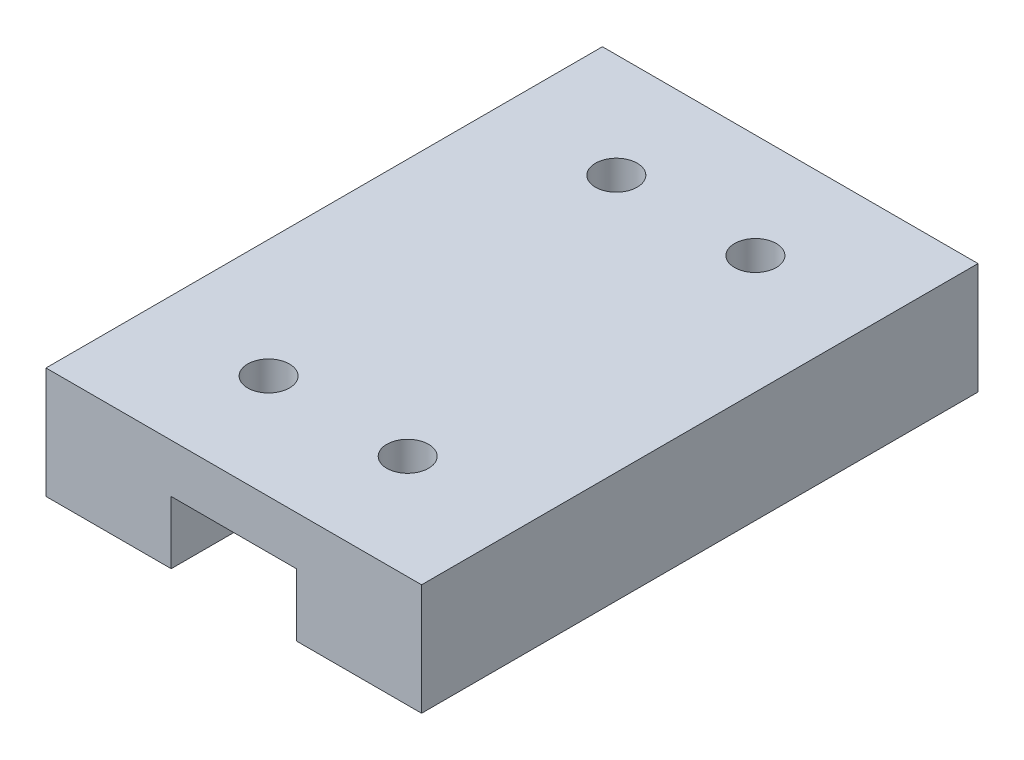
ISO-10303-21;
HEADER;
FILE_DESCRIPTION(('STEP AP214'),'2;1');
FILE_NAME('part.step','',(''),(''),'','','');
FILE_SCHEMA(('AUTOMOTIVE_DESIGN { 1 0 10303 214 1 1 1 1 }'));
ENDSEC;
DATA;
#1=APPLICATION_CONTEXT('core data for automotive mechanical design processes');
#2=APPLICATION_PROTOCOL_DEFINITION('international standard','automotive_design',2000,#1);
#3=PRODUCT_CONTEXT('',#1,'mechanical');
#4=PRODUCT('Part','Part','',(#3));
#5=PRODUCT_RELATED_PRODUCT_CATEGORY('part','',(#4));
#6=PRODUCT_DEFINITION_FORMATION('','',#4);
#7=PRODUCT_DEFINITION_CONTEXT('part definition',#1,'design');
#8=PRODUCT_DEFINITION('design','',#6,#7);
#9=PRODUCT_DEFINITION_SHAPE('','',#8);
#10=(LENGTH_UNIT() NAMED_UNIT(*) SI_UNIT(.MILLI.,.METRE.));
#11=(NAMED_UNIT(*) PLANE_ANGLE_UNIT() SI_UNIT($,.RADIAN.));
#12=(NAMED_UNIT(*) SI_UNIT($,.STERADIAN.) SOLID_ANGLE_UNIT());
#13=UNCERTAINTY_MEASURE_WITH_UNIT(LENGTH_MEASURE(1.E-05),#10,'distance_accuracy_value','');
#14=(GEOMETRIC_REPRESENTATION_CONTEXT(3) GLOBAL_UNCERTAINTY_ASSIGNED_CONTEXT((#13)) GLOBAL_UNIT_ASSIGNED_CONTEXT((#10,
#11,#12)) REPRESENTATION_CONTEXT('',''));
#15=CARTESIAN_POINT('',(0.,0.,0.));
#16=DIRECTION('',(0.,0.,1.));
#17=DIRECTION('',(1.,0.,0.));
#18=AXIS2_PLACEMENT_3D('',#15,#16,#17);
#19=CARTESIAN_POINT('',(4.5,4.5,20.));
#20=DIRECTION('',(1.,0.,0.));
#21=DIRECTION('',(0.,0.,-1.));
#22=AXIS2_PLACEMENT_3D('',#19,#20,#21);
#23=PLANE('',#22);
#24=DIRECTION('',(0.,-1.,0.));
#25=VECTOR('',#24,1.);
#26=CARTESIAN_POINT('',(4.5,4.5,-20.));
#27=LINE('',#26,#25);
#28=CARTESIAN_POINT('',(4.5,4.5,-20.));
#29=VERTEX_POINT('',#28);
#30=CARTESIAN_POINT('',(4.5,0.,-20.));
#31=VERTEX_POINT('',#30);
#32=EDGE_CURVE('E137',#29,#31,#27,.T.);
#33=ORIENTED_EDGE('',*,*,#32,.T.);
#34=DIRECTION('',(0.,0.,-1.));
#35=VECTOR('',#34,1.);
#36=CARTESIAN_POINT('',(4.5,0.,20.));
#37=LINE('',#36,#35);
#38=CARTESIAN_POINT('',(4.5,0.,20.));
#39=VERTEX_POINT('',#38);
#40=EDGE_CURVE('E11',#39,#31,#37,.T.);
#41=ORIENTED_EDGE('',*,*,#40,.F.);
#42=DIRECTION('',(0.,-1.,0.));
#43=VECTOR('',#42,1.);
#44=CARTESIAN_POINT('',(4.5,4.5,20.));
#45=LINE('',#44,#43);
#46=CARTESIAN_POINT('',(4.5,4.5,20.));
#47=VERTEX_POINT('',#46);
#48=EDGE_CURVE('E152',#47,#39,#45,.T.);
#49=ORIENTED_EDGE('',*,*,#48,.F.);
#50=DIRECTION('',(0.,0.,-1.));
#51=VECTOR('',#50,1.);
#52=CARTESIAN_POINT('',(4.5,4.5,20.));
#53=LINE('',#52,#51);
#54=EDGE_CURVE('E133',#47,#29,#53,.T.);
#55=ORIENTED_EDGE('',*,*,#54,.T.);
#56=EDGE_LOOP('',(#33,#41,#49,#55));
#57=FACE_BOUND('',#56,.T.);
#58=ADVANCED_FACE('F41',(#57),#23,.F.);
#59=CARTESIAN_POINT('',(4.5,0.,20.));
#60=DIRECTION('',(0.,1.,0.));
#61=DIRECTION('',(-1.,0.,0.));
#62=AXIS2_PLACEMENT_3D('',#59,#60,#61);
#63=PLANE('',#62);
#64=DIRECTION('',(1.,0.,0.));
#65=VECTOR('',#64,1.);
#66=CARTESIAN_POINT('',(4.5,0.,-20.));
#67=LINE('',#66,#65);
#68=CARTESIAN_POINT('',(13.5,0.,-20.));
#69=VERTEX_POINT('',#68);
#70=EDGE_CURVE('E140',#31,#69,#67,.T.);
#71=ORIENTED_EDGE('',*,*,#70,.T.);
#72=DIRECTION('',(0.,0.,-1.));
#73=VECTOR('',#72,1.);
#74=CARTESIAN_POINT('',(13.5,0.,20.));
#75=LINE('',#74,#73);
#76=CARTESIAN_POINT('',(13.5,0.,20.));
#77=VERTEX_POINT('',#76);
#78=EDGE_CURVE('E49',#77,#69,#75,.T.);
#79=ORIENTED_EDGE('',*,*,#78,.F.);
#80=DIRECTION('',(1.,0.,0.));
#81=VECTOR('',#80,1.);
#82=CARTESIAN_POINT('',(4.5,0.,20.));
#83=LINE('',#82,#81);
#84=EDGE_CURVE('E100',#39,#77,#83,.T.);
#85=ORIENTED_EDGE('',*,*,#84,.F.);
#86=ORIENTED_EDGE('',*,*,#40,.T.);
#87=EDGE_LOOP('',(#71,#79,#85,#86));
#88=FACE_BOUND('',#87,.T.);
#89=ADVANCED_FACE('F238',(#88),#63,.F.);
#90=CARTESIAN_POINT('',(13.5,0.,20.));
#91=DIRECTION('',(-1.,0.,0.));
#92=DIRECTION('',(0.,0.,1.));
#93=AXIS2_PLACEMENT_3D('',#90,#91,#92);
#94=PLANE('',#93);
#95=DIRECTION('',(0.,1.,0.));
#96=VECTOR('',#95,1.);
#97=CARTESIAN_POINT('',(13.5,0.,-20.));
#98=LINE('',#97,#96);
#99=CARTESIAN_POINT('',(13.5,8.,-20.));
#100=VERTEX_POINT('',#99);
#101=EDGE_CURVE('E143',#69,#100,#98,.T.);
#102=ORIENTED_EDGE('',*,*,#101,.T.);
#103=DIRECTION('',(0.,0.,-1.));
#104=VECTOR('',#103,1.);
#105=CARTESIAN_POINT('',(13.5,8.,20.));
#106=LINE('',#105,#104);
#107=CARTESIAN_POINT('',(13.5,8.,20.));
#108=VERTEX_POINT('',#107);
#109=EDGE_CURVE('E159',#108,#100,#106,.T.);
#110=ORIENTED_EDGE('',*,*,#109,.F.);
#111=DIRECTION('',(0.,1.,0.));
#112=VECTOR('',#111,1.);
#113=CARTESIAN_POINT('',(13.5,0.,20.));
#114=LINE('',#113,#112);
#115=EDGE_CURVE('E167',#77,#108,#114,.T.);
#116=ORIENTED_EDGE('',*,*,#115,.F.);
#117=ORIENTED_EDGE('',*,*,#78,.T.);
#118=EDGE_LOOP('',(#102,#110,#116,#117));
#119=FACE_BOUND('',#118,.T.);
#120=ADVANCED_FACE('F165',(#119),#94,.F.);
#121=CARTESIAN_POINT('',(13.5,8.,20.));
#122=DIRECTION('',(0.,-1.,0.));
#123=DIRECTION('',(1.,0.,0.));
#124=AXIS2_PLACEMENT_3D('',#121,#122,#123);
#125=PLANE('',#124);
#126=CARTESIAN_POINT('',(5.,8.,12.5));
#127=DIRECTION('',(0.,1.,0.));
#128=DIRECTION('',(1.,0.,0.));
#129=AXIS2_PLACEMENT_3D('',#126,#127,#128);
#130=CIRCLE('',#129,1.5);
#131=CARTESIAN_POINT('',(6.5,8.,12.5));
#132=VERTEX_POINT('',#131);
#133=EDGE_CURVE('E191',#132,#132,#130,.T.);
#134=ORIENTED_EDGE('',*,*,#133,.F.);
#135=EDGE_LOOP('',(#134));
#136=FACE_BOUND('',#135,.T.);
#137=CARTESIAN_POINT('',(-5.,8.,12.5));
#138=DIRECTION('',(0.,1.,0.));
#139=DIRECTION('',(-1.,0.,0.));
#140=AXIS2_PLACEMENT_3D('',#137,#138,#139);
#141=CIRCLE('',#140,1.5);
#142=CARTESIAN_POINT('',(-6.5,8.,12.5));
#143=VERTEX_POINT('',#142);
#144=EDGE_CURVE('E197',#143,#143,#141,.T.);
#145=ORIENTED_EDGE('',*,*,#144,.F.);
#146=EDGE_LOOP('',(#145));
#147=FACE_BOUND('',#146,.T.);
#148=CARTESIAN_POINT('',(-5.,8.,-12.5));
#149=DIRECTION('',(0.,1.,0.));
#150=DIRECTION('',(1.,0.,0.));
#151=AXIS2_PLACEMENT_3D('',#148,#149,#150);
#152=CIRCLE('',#151,1.5);
#153=CARTESIAN_POINT('',(-3.5,8.,-12.5));
#154=VERTEX_POINT('',#153);
#155=EDGE_CURVE('E203',#154,#154,#152,.T.);
#156=ORIENTED_EDGE('',*,*,#155,.F.);
#157=EDGE_LOOP('',(#156));
#158=FACE_BOUND('',#157,.T.);
#159=CARTESIAN_POINT('',(5.,8.,-12.5));
#160=DIRECTION('',(0.,1.,0.));
#161=DIRECTION('',(-1.,0.,0.));
#162=AXIS2_PLACEMENT_3D('',#159,#160,#161);
#163=CIRCLE('',#162,1.5);
#164=CARTESIAN_POINT('',(3.5,8.,-12.5));
#165=VERTEX_POINT('',#164);
#166=EDGE_CURVE('E185',#165,#165,#163,.T.);
#167=ORIENTED_EDGE('',*,*,#166,.F.);
#168=EDGE_LOOP('',(#167));
#169=FACE_BOUND('',#168,.T.);
#170=DIRECTION('',(-1.,0.,0.));
#171=VECTOR('',#170,1.);
#172=CARTESIAN_POINT('',(13.5,8.,-20.));
#173=LINE('',#172,#171);
#174=CARTESIAN_POINT('',(-13.5,8.,-20.));
#175=VERTEX_POINT('',#174);
#176=EDGE_CURVE('E145',#100,#175,#173,.T.);
#177=ORIENTED_EDGE('',*,*,#176,.T.);
#178=DIRECTION('',(0.,0.,-1.));
#179=VECTOR('',#178,1.);
#180=CARTESIAN_POINT('',(-13.5,8.,20.));
#181=LINE('',#180,#179);
#182=CARTESIAN_POINT('',(-13.5,8.,20.));
#183=VERTEX_POINT('',#182);
#184=EDGE_CURVE('E156',#183,#175,#181,.T.);
#185=ORIENTED_EDGE('',*,*,#184,.F.);
#186=DIRECTION('',(-1.,0.,0.));
#187=VECTOR('',#186,1.);
#188=CARTESIAN_POINT('',(13.5,8.,20.));
#189=LINE('',#188,#187);
#190=EDGE_CURVE('E179',#108,#183,#189,.T.);
#191=ORIENTED_EDGE('',*,*,#190,.F.);
#192=ORIENTED_EDGE('',*,*,#109,.T.);
#193=EDGE_LOOP('',(#177,#185,#191,#192));
#194=FACE_BOUND('',#193,.T.);
#195=ADVANCED_FACE('F175',(#136,#147,#158,#169,#194),#125,.F.);
#196=CARTESIAN_POINT('',(-13.5,0.,20.));
#197=DIRECTION('',(1.,0.,0.));
#198=DIRECTION('',(0.,1.,0.));
#199=AXIS2_PLACEMENT_3D('',#196,#197,#198);
#200=PLANE('',#199);
#201=DIRECTION('',(0.,-1.,0.));
#202=VECTOR('',#201,1.);
#203=CARTESIAN_POINT('',(-13.5,0.,-20.));
#204=LINE('',#203,#202);
#205=CARTESIAN_POINT('',(-13.5,0.,-20.));
#206=VERTEX_POINT('',#205);
#207=EDGE_CURVE('E147',#175,#206,#204,.T.);
#208=ORIENTED_EDGE('',*,*,#207,.T.);
#209=DIRECTION('',(0.,0.,-1.));
#210=VECTOR('',#209,1.);
#211=CARTESIAN_POINT('',(-13.5,0.,20.));
#212=LINE('',#211,#210);
#213=CARTESIAN_POINT('',(-13.5,0.,20.));
#214=VERTEX_POINT('',#213);
#215=EDGE_CURVE('E128',#214,#206,#212,.T.);
#216=ORIENTED_EDGE('',*,*,#215,.F.);
#217=DIRECTION('',(0.,-1.,0.));
#218=VECTOR('',#217,1.);
#219=CARTESIAN_POINT('',(-13.5,0.,20.));
#220=LINE('',#219,#218);
#221=EDGE_CURVE('E119',#183,#214,#220,.T.);
#222=ORIENTED_EDGE('',*,*,#221,.F.);
#223=ORIENTED_EDGE('',*,*,#184,.T.);
#224=EDGE_LOOP('',(#208,#216,#222,#223));
#225=FACE_BOUND('',#224,.T.);
#226=ADVANCED_FACE('F178',(#225),#200,.F.);
#227=CARTESIAN_POINT('',(-4.5,0.,20.));
#228=DIRECTION('',(0.,1.,0.));
#229=DIRECTION('',(-1.,0.,0.));
#230=AXIS2_PLACEMENT_3D('',#227,#228,#229);
#231=PLANE('',#230);
#232=DIRECTION('',(1.,0.,0.));
#233=VECTOR('',#232,1.);
#234=CARTESIAN_POINT('',(-4.5,0.,-20.));
#235=LINE('',#234,#233);
#236=CARTESIAN_POINT('',(-4.5,0.,-20.));
#237=VERTEX_POINT('',#236);
#238=EDGE_CURVE('E127',#206,#237,#235,.T.);
#239=ORIENTED_EDGE('',*,*,#238,.T.);
#240=DIRECTION('',(0.,0.,-1.));
#241=VECTOR('',#240,1.);
#242=CARTESIAN_POINT('',(-4.5,0.,20.));
#243=LINE('',#242,#241);
#244=CARTESIAN_POINT('',(-4.5,0.,20.));
#245=VERTEX_POINT('',#244);
#246=EDGE_CURVE('E124',#245,#237,#243,.T.);
#247=ORIENTED_EDGE('',*,*,#246,.F.);
#248=DIRECTION('',(1.,0.,0.));
#249=VECTOR('',#248,1.);
#250=CARTESIAN_POINT('',(-4.5,0.,20.));
#251=LINE('',#250,#249);
#252=EDGE_CURVE('E113',#214,#245,#251,.T.);
#253=ORIENTED_EDGE('',*,*,#252,.F.);
#254=ORIENTED_EDGE('',*,*,#215,.T.);
#255=EDGE_LOOP('',(#239,#247,#253,#254));
#256=FACE_BOUND('',#255,.T.);
#257=ADVANCED_FACE('F125',(#256),#231,.F.);
#258=CARTESIAN_POINT('',(-4.5,4.5,20.));
#259=DIRECTION('',(-1.,0.,0.));
#260=DIRECTION('',(0.,-1.,0.));
#261=AXIS2_PLACEMENT_3D('',#258,#259,#260);
#262=PLANE('',#261);
#263=DIRECTION('',(0.,1.,0.));
#264=VECTOR('',#263,1.);
#265=CARTESIAN_POINT('',(-4.5,4.5,-20.));
#266=LINE('',#265,#264);
#267=CARTESIAN_POINT('',(-4.5,4.5,-20.));
#268=VERTEX_POINT('',#267);
#269=EDGE_CURVE('E86',#237,#268,#266,.T.);
#270=ORIENTED_EDGE('',*,*,#269,.T.);
#271=DIRECTION('',(0.,0.,-1.));
#272=VECTOR('',#271,1.);
#273=CARTESIAN_POINT('',(-4.5,4.5,20.));
#274=LINE('',#273,#272);
#275=CARTESIAN_POINT('',(-4.5,4.5,20.));
#276=VERTEX_POINT('',#275);
#277=EDGE_CURVE('E129',#276,#268,#274,.T.);
#278=ORIENTED_EDGE('',*,*,#277,.F.);
#279=DIRECTION('',(0.,1.,0.));
#280=VECTOR('',#279,1.);
#281=CARTESIAN_POINT('',(-4.5,4.5,20.));
#282=LINE('',#281,#280);
#283=EDGE_CURVE('E117',#245,#276,#282,.T.);
#284=ORIENTED_EDGE('',*,*,#283,.F.);
#285=ORIENTED_EDGE('',*,*,#246,.T.);
#286=EDGE_LOOP('',(#270,#278,#284,#285));
#287=FACE_BOUND('',#286,.T.);
#288=ADVANCED_FACE('F131',(#287),#262,.F.);
#289=CARTESIAN_POINT('',(-4.5,4.5,20.));
#290=DIRECTION('',(0.,1.,0.));
#291=DIRECTION('',(-1.,0.,0.));
#292=AXIS2_PLACEMENT_3D('',#289,#290,#291);
#293=PLANE('',#292);
#294=DIRECTION('',(1.,0.,0.));
#295=VECTOR('',#294,1.);
#296=CARTESIAN_POINT('',(-4.5,4.5,-20.));
#297=LINE('',#296,#295);
#298=EDGE_CURVE('E92',#268,#29,#297,.T.);
#299=ORIENTED_EDGE('',*,*,#298,.T.);
#300=ORIENTED_EDGE('',*,*,#54,.F.);
#301=DIRECTION('',(1.,0.,0.));
#302=VECTOR('',#301,1.);
#303=CARTESIAN_POINT('',(-4.5,4.5,20.));
#304=LINE('',#303,#302);
#305=EDGE_CURVE('E57',#276,#47,#304,.T.);
#306=ORIENTED_EDGE('',*,*,#305,.F.);
#307=ORIENTED_EDGE('',*,*,#277,.T.);
#308=EDGE_LOOP('',(#299,#300,#306,#307));
#309=FACE_BOUND('',#308,.T.);
#310=ADVANCED_FACE('F245',(#309),#293,.F.);
#311=CARTESIAN_POINT('',(0.,0.,20.));
#312=DIRECTION('',(0.,0.,1.));
#313=DIRECTION('',(1.,0.,0.));
#314=AXIS2_PLACEMENT_3D('',#311,#312,#313);
#315=PLANE('',#314);
#316=ORIENTED_EDGE('',*,*,#48,.T.);
#317=ORIENTED_EDGE('',*,*,#84,.T.);
#318=ORIENTED_EDGE('',*,*,#115,.T.);
#319=ORIENTED_EDGE('',*,*,#190,.T.);
#320=ORIENTED_EDGE('',*,*,#221,.T.);
#321=ORIENTED_EDGE('',*,*,#252,.T.);
#322=ORIENTED_EDGE('',*,*,#283,.T.);
#323=ORIENTED_EDGE('',*,*,#305,.T.);
#324=EDGE_LOOP('',(#316,#317,#318,#319,#320,#321,#322,#323));
#325=FACE_BOUND('',#324,.T.);
#326=ADVANCED_FACE('F115',(#325),#315,.T.);
#327=CARTESIAN_POINT('',(0.,0.,-20.));
#328=DIRECTION('',(0.,0.,1.));
#329=DIRECTION('',(1.,0.,0.));
#330=AXIS2_PLACEMENT_3D('',#327,#328,#329);
#331=PLANE('',#330);
#332=ORIENTED_EDGE('',*,*,#32,.F.);
#333=ORIENTED_EDGE('',*,*,#298,.F.);
#334=ORIENTED_EDGE('',*,*,#269,.F.);
#335=ORIENTED_EDGE('',*,*,#238,.F.);
#336=ORIENTED_EDGE('',*,*,#207,.F.);
#337=ORIENTED_EDGE('',*,*,#176,.F.);
#338=ORIENTED_EDGE('',*,*,#101,.F.);
#339=ORIENTED_EDGE('',*,*,#70,.F.);
#340=EDGE_LOOP('',(#332,#333,#334,#335,#336,#337,#338,#339));
#341=FACE_BOUND('',#340,.T.);
#342=ADVANCED_FACE('F171',(#341),#331,.F.);
#343=CARTESIAN_POINT('',(5.,5.5,-12.5));
#344=DIRECTION('',(0.,1.,0.));
#345=DIRECTION('',(-1.,0.,0.));
#346=AXIS2_PLACEMENT_3D('',#343,#344,#345);
#347=CYLINDRICAL_SURFACE('',#346,1.5);
#348=CARTESIAN_POINT('',(5.,5.5,-12.5));
#349=DIRECTION('',(0.,1.,0.));
#350=DIRECTION('',(-1.,0.,0.));
#351=AXIS2_PLACEMENT_3D('',#348,#349,#350);
#352=CIRCLE('',#351,1.5);
#353=CARTESIAN_POINT('',(3.5,5.5,-12.5));
#354=VERTEX_POINT('',#353);
#355=EDGE_CURVE('E141',#354,#354,#352,.T.);
#356=ORIENTED_EDGE('',*,*,#355,.F.);
#357=EDGE_LOOP('',(#356));
#358=FACE_BOUND('',#357,.T.);
#359=ORIENTED_EDGE('',*,*,#166,.T.);
#360=EDGE_LOOP('',(#359));
#361=FACE_BOUND('',#360,.T.);
#362=ADVANCED_FACE('F224',(#358,#361),#347,.F.);
#363=CARTESIAN_POINT('',(5.,5.5,-12.5));
#364=DIRECTION('',(0.,1.,0.));
#365=DIRECTION('',(-1.,0.,0.));
#366=AXIS2_PLACEMENT_3D('',#363,#364,#365);
#367=PLANE('',#366);
#368=ORIENTED_EDGE('',*,*,#355,.T.);
#369=EDGE_LOOP('',(#368));
#370=FACE_BOUND('',#369,.T.);
#371=ADVANCED_FACE('F214',(#370),#367,.T.);
#372=CARTESIAN_POINT('',(-5.,5.5,-12.5));
#373=DIRECTION('',(0.,1.,0.));
#374=DIRECTION('',(-1.,0.,0.));
#375=AXIS2_PLACEMENT_3D('',#372,#373,#374);
#376=CYLINDRICAL_SURFACE('',#375,1.5);
#377=CARTESIAN_POINT('',(-5.,5.5,-12.5));
#378=DIRECTION('',(0.,1.,0.));
#379=DIRECTION('',(1.,0.,0.));
#380=AXIS2_PLACEMENT_3D('',#377,#378,#379);
#381=CIRCLE('',#380,1.5);
#382=CARTESIAN_POINT('',(-3.5,5.5,-12.5));
#383=VERTEX_POINT('',#382);
#384=EDGE_CURVE('E188',#383,#383,#381,.T.);
#385=ORIENTED_EDGE('',*,*,#384,.F.);
#386=EDGE_LOOP('',(#385));
#387=FACE_BOUND('',#386,.T.);
#388=ORIENTED_EDGE('',*,*,#155,.T.);
#389=EDGE_LOOP('',(#388));
#390=FACE_BOUND('',#389,.T.);
#391=ADVANCED_FACE('F211',(#387,#390),#376,.F.);
#392=CARTESIAN_POINT('',(-5.,5.5,-12.5));
#393=DIRECTION('',(0.,-1.,0.));
#394=DIRECTION('',(1.,0.,0.));
#395=AXIS2_PLACEMENT_3D('',#392,#393,#394);
#396=PLANE('',#395);
#397=ORIENTED_EDGE('',*,*,#384,.T.);
#398=EDGE_LOOP('',(#397));
#399=FACE_BOUND('',#398,.T.);
#400=ADVANCED_FACE('F209',(#399),#396,.F.);
#401=CARTESIAN_POINT('',(-5.,5.5,12.5));
#402=DIRECTION('',(0.,1.,0.));
#403=DIRECTION('',(-1.,0.,0.));
#404=AXIS2_PLACEMENT_3D('',#401,#402,#403);
#405=CYLINDRICAL_SURFACE('',#404,1.5);
#406=CARTESIAN_POINT('',(-5.,5.5,12.5));
#407=DIRECTION('',(0.,1.,0.));
#408=DIRECTION('',(-1.,0.,0.));
#409=AXIS2_PLACEMENT_3D('',#406,#407,#408);
#410=CIRCLE('',#409,1.5);
#411=CARTESIAN_POINT('',(-6.5,5.5,12.5));
#412=VERTEX_POINT('',#411);
#413=EDGE_CURVE('E200',#412,#412,#410,.T.);
#414=ORIENTED_EDGE('',*,*,#413,.F.);
#415=EDGE_LOOP('',(#414));
#416=FACE_BOUND('',#415,.T.);
#417=ORIENTED_EDGE('',*,*,#144,.T.);
#418=EDGE_LOOP('',(#417));
#419=FACE_BOUND('',#418,.T.);
#420=ADVANCED_FACE('F321',(#416,#419),#405,.F.);
#421=CARTESIAN_POINT('',(-5.,5.5,12.5));
#422=DIRECTION('',(0.,1.,0.));
#423=DIRECTION('',(-1.,0.,0.));
#424=AXIS2_PLACEMENT_3D('',#421,#422,#423);
#425=PLANE('',#424);
#426=ORIENTED_EDGE('',*,*,#413,.T.);
#427=EDGE_LOOP('',(#426));
#428=FACE_BOUND('',#427,.T.);
#429=ADVANCED_FACE('F330',(#428),#425,.T.);
#430=CARTESIAN_POINT('',(5.,5.5,12.5));
#431=DIRECTION('',(0.,1.,0.));
#432=DIRECTION('',(-1.,0.,0.));
#433=AXIS2_PLACEMENT_3D('',#430,#431,#432);
#434=CYLINDRICAL_SURFACE('',#433,1.5);
#435=CARTESIAN_POINT('',(5.,5.5,12.5));
#436=DIRECTION('',(0.,1.,0.));
#437=DIRECTION('',(1.,0.,0.));
#438=AXIS2_PLACEMENT_3D('',#435,#436,#437);
#439=CIRCLE('',#438,1.5);
#440=CARTESIAN_POINT('',(6.5,5.5,12.5));
#441=VERTEX_POINT('',#440);
#442=EDGE_CURVE('E194',#441,#441,#439,.T.);
#443=ORIENTED_EDGE('',*,*,#442,.F.);
#444=EDGE_LOOP('',(#443));
#445=FACE_BOUND('',#444,.T.);
#446=ORIENTED_EDGE('',*,*,#133,.T.);
#447=EDGE_LOOP('',(#446));
#448=FACE_BOUND('',#447,.T.);
#449=ADVANCED_FACE('F340',(#445,#448),#434,.F.);
#450=CARTESIAN_POINT('',(5.,5.5,12.5));
#451=DIRECTION('',(0.,-1.,0.));
#452=DIRECTION('',(1.,0.,0.));
#453=AXIS2_PLACEMENT_3D('',#450,#451,#452);
#454=PLANE('',#453);
#455=ORIENTED_EDGE('',*,*,#442,.T.);
#456=EDGE_LOOP('',(#455));
#457=FACE_BOUND('',#456,.T.);
#458=ADVANCED_FACE('F350',(#457),#454,.F.);
#459=CLOSED_SHELL('',(#58,#89,#120,#195,#226,#257,#288,#310,#326,#342,#362,#371,#391,#400,#420,
#429,#449,#458));
#460=MANIFOLD_SOLID_BREP('B2',#459);
#461=ADVANCED_BREP_SHAPE_REPRESENTATION('',(#18,#460),#14);
#462=SHAPE_DEFINITION_REPRESENTATION(#9,#461);
ENDSEC;
END-ISO-10303-21;
